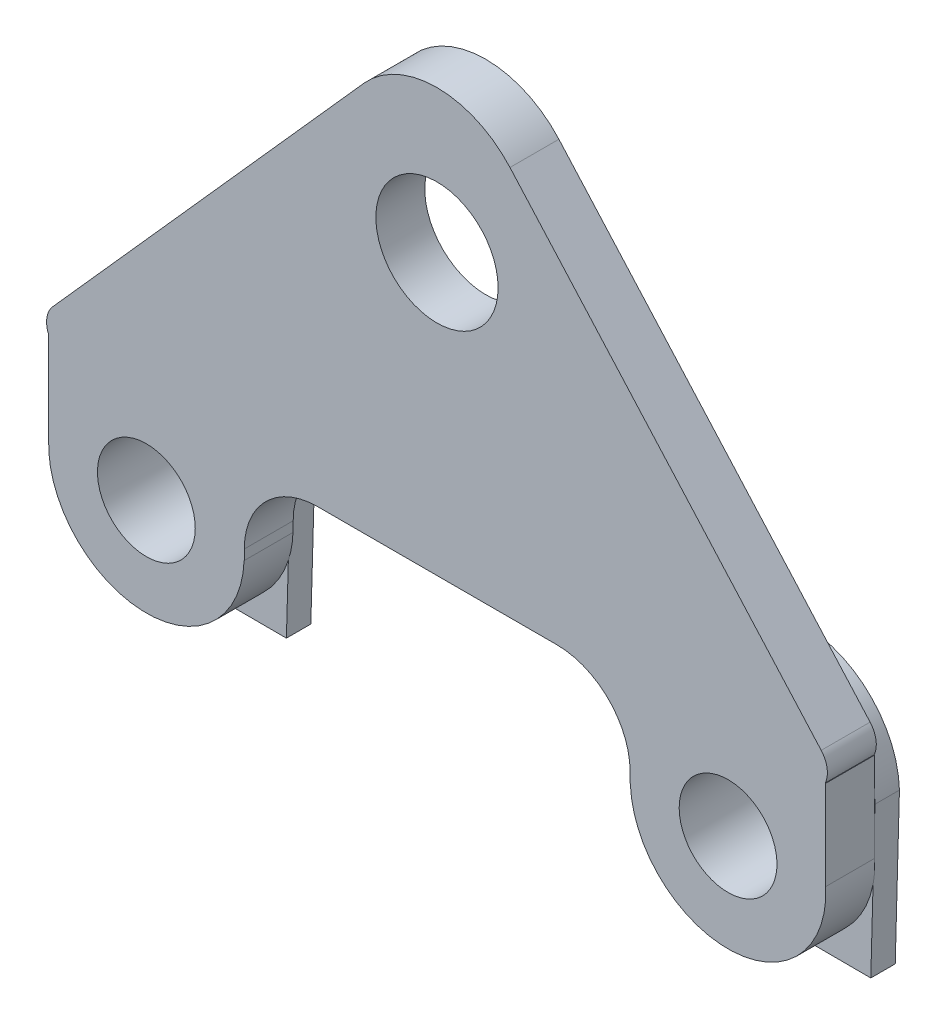
ISO-10303-21;
HEADER;
FILE_DESCRIPTION(('STEP AP214'),'2;1');
FILE_NAME('part.step','',(''),(''),'','','');
FILE_SCHEMA(('AUTOMOTIVE_DESIGN { 1 0 10303 214 1 1 1 1 }'));
ENDSEC;
DATA;
#1=APPLICATION_CONTEXT('core data for automotive mechanical design processes');
#2=APPLICATION_PROTOCOL_DEFINITION('international standard','automotive_design',2000,#1);
#3=PRODUCT_CONTEXT('',#1,'mechanical');
#4=PRODUCT('Part','Part','',(#3));
#5=PRODUCT_RELATED_PRODUCT_CATEGORY('part','',(#4));
#6=PRODUCT_DEFINITION_FORMATION('','',#4);
#7=PRODUCT_DEFINITION_CONTEXT('part definition',#1,'design');
#8=PRODUCT_DEFINITION('design','',#6,#7);
#9=PRODUCT_DEFINITION_SHAPE('','',#8);
#10=(LENGTH_UNIT() NAMED_UNIT(*) SI_UNIT(.MILLI.,.METRE.));
#11=(NAMED_UNIT(*) PLANE_ANGLE_UNIT() SI_UNIT($,.RADIAN.));
#12=(NAMED_UNIT(*) SI_UNIT($,.STERADIAN.) SOLID_ANGLE_UNIT());
#13=UNCERTAINTY_MEASURE_WITH_UNIT(LENGTH_MEASURE(1.E-05),#10,'distance_accuracy_value','');
#14=(GEOMETRIC_REPRESENTATION_CONTEXT(3) GLOBAL_UNCERTAINTY_ASSIGNED_CONTEXT((#13)) GLOBAL_UNIT_ASSIGNED_CONTEXT((#10,
#11,#12)) REPRESENTATION_CONTEXT('',''));
#15=CARTESIAN_POINT('',(0.,0.,0.));
#16=DIRECTION('',(0.,0.,1.));
#17=DIRECTION('',(1.,0.,0.));
#18=AXIS2_PLACEMENT_3D('',#15,#16,#17);
#19=CARTESIAN_POINT('',(0.,0.,0.));
#20=DIRECTION('',(0.,0.,-1.));
#21=DIRECTION('',(-1.,0.,0.));
#22=AXIS2_PLACEMENT_3D('',#19,#20,#21);
#23=PLANE('',#22);
#24=CARTESIAN_POINT('',(9.68072200830674,22.887439188464,0.));
#25=DIRECTION('',(0.,0.,1.));
#26=DIRECTION('',(1.,0.,0.));
#27=AXIS2_PLACEMENT_3D('',#24,#25,#26);
#28=CIRCLE('',#27,5.);
#29=CARTESIAN_POINT('',(14.6807220083067,22.887439188464,0.));
#30=VERTEX_POINT('',#29);
#31=EDGE_CURVE('E377',#30,#30,#28,.T.);
#32=ORIENTED_EDGE('',*,*,#31,.T.);
#33=EDGE_LOOP('',(#32));
#34=FACE_BOUND('',#33,.T.);
#35=CARTESIAN_POINT('',(-14.0923385126825,-6.5484072425761,0.));
#36=DIRECTION('',(0.,0.,1.));
#37=DIRECTION('',(1.,0.,0.));
#38=AXIS2_PLACEMENT_3D('',#35,#36,#37);
#39=CIRCLE('',#38,8.);
#40=CARTESIAN_POINT('',(-6.47842129879628,-9.00365970619087,0.));
#41=VERTEX_POINT('',#40);
#42=CARTESIAN_POINT('',(-6.09688509947379,-6.81808244946121,0.));
#43=VERTEX_POINT('',#42);
#44=EDGE_CURVE('E350',#41,#43,#39,.T.);
#45=ORIENTED_EDGE('',*,*,#44,.F.);
#46=DIRECTION('',(-0.0284940678115192,-0.999593961616192,0.));
#47=VECTOR('',#46,1.);
#48=CARTESIAN_POINT('',(-6.3007414125917,-2.77051172164984,0.));
#49=LINE('',#48,#47);
#50=CARTESIAN_POINT('',(-6.3007414125917,-2.77051172164984,0.));
#51=VERTEX_POINT('',#50);
#52=EDGE_CURVE('E54',#51,#41,#49,.T.);
#53=ORIENTED_EDGE('',*,*,#52,.F.);
#54=CARTESIAN_POINT('',(-14.0923385126825,-2.5484072425761,0.));
#55=DIRECTION('',(0.,0.,-1.));
#56=DIRECTION('',(-1.,0.,0.));
#57=AXIS2_PLACEMENT_3D('',#54,#55,#56);
#58=CIRCLE('',#57,7.79476207268501);
#59=CARTESIAN_POINT('',(-21.8839356127734,-2.32630276350236,0.));
#60=VERTEX_POINT('',#59);
#61=EDGE_CURVE('E258',#60,#51,#58,.T.);
#62=ORIENTED_EDGE('',*,*,#61,.F.);
#63=DIRECTION('',(0.0284940678115191,0.999593961616192,0.));
#64=VECTOR('',#63,1.);
#65=CARTESIAN_POINT('',(-21.8839356127734,-2.32630276350236,0.));
#66=LINE('',#65,#64);
#67=CARTESIAN_POINT('',(-22.0321989801702,-7.5274964912289,0.));
#68=VERTEX_POINT('',#67);
#69=EDGE_CURVE('E468',#68,#60,#66,.T.);
#70=ORIENTED_EDGE('',*,*,#69,.F.);
#71=CARTESIAN_POINT('',(-22.081618266519,-6.13439152434961,0.));
#72=VERTEX_POINT('',#71);
#73=EDGE_CURVE('E346',#72,#68,#39,.T.);
#74=ORIENTED_EDGE('',*,*,#73,.F.);
#75=DIRECTION('',(0.,-1.,0.));
#76=VECTOR('',#75,1.);
#77=CARTESIAN_POINT('',(-22.081618266519,-6.81808244946121,0.));
#78=LINE('',#77,#76);
#79=CARTESIAN_POINT('',(-22.081618266519,1.18191755053879,0.));
#80=VERTEX_POINT('',#79);
#81=EDGE_CURVE('E354',#80,#72,#78,.T.);
#82=ORIENTED_EDGE('',*,*,#81,.F.);
#83=CARTESIAN_POINT('',(-20.2565864569651,2.,0.));
#84=DIRECTION('',(0.,0.,-1.));
#85=DIRECTION('',(-1.,0.,0.));
#86=AXIS2_PLACEMENT_3D('',#83,#84,#85);
#87=CIRCLE('',#86,2.);
#88=CARTESIAN_POINT('',(-21.7496129500696,3.33074110588354,0.));
#89=VERTEX_POINT('',#88);
#90=EDGE_CURVE('E412',#80,#89,#87,.T.);
#91=ORIENTED_EDGE('',*,*,#90,.T.);
#92=DIRECTION('',(-0.665370552941771,-0.746513246552237,0.));
#93=VECTOR('',#92,1.);
#94=CARTESIAN_POINT('',(-24.718317204901,0.,0.));
#95=LINE('',#94,#93);
#96=CARTESIAN_POINT('',(3.70861603588884,31.8936299920127,0.));
#97=VERTEX_POINT('',#96);
#98=EDGE_CURVE('E380',#97,#89,#95,.T.);
#99=ORIENTED_EDGE('',*,*,#98,.F.);
#100=CARTESIAN_POINT('',(9.68072200830674,26.5706655684785,0.));
#101=DIRECTION('',(0.,0.,-1.));
#102=DIRECTION('',(-1.,0.,0.));
#103=AXIS2_PLACEMENT_3D('',#100,#101,#102);
#104=CIRCLE('',#103,8.);
#105=CARTESIAN_POINT('',(15.6528279807246,31.8936299920127,0.));
#106=VERTEX_POINT('',#105);
#107=EDGE_CURVE('E401',#97,#106,#104,.T.);
#108=ORIENTED_EDGE('',*,*,#107,.T.);
#109=DIRECTION('',(-0.665370552941771,0.746513246552237,0.));
#110=VECTOR('',#109,1.);
#111=CARTESIAN_POINT('',(9.68072200830674,38.5940410614726,0.));
#112=LINE('',#111,#110);
#113=CARTESIAN_POINT('',(41.1110569666831,3.33074110588354,0.));
#114=VERTEX_POINT('',#113);
#115=EDGE_CURVE('E387',#114,#106,#112,.T.);
#116=ORIENTED_EDGE('',*,*,#115,.F.);
#117=CARTESIAN_POINT('',(39.6180304735786,2.,0.));
#118=DIRECTION('',(0.,0.,-1.));
#119=DIRECTION('',(-1.,0.,0.));
#120=AXIS2_PLACEMENT_3D('',#117,#118,#119);
#121=CIRCLE('',#120,2.);
#122=CARTESIAN_POINT('',(41.4430622831325,1.18191755053879,0.));
#123=VERTEX_POINT('',#122);
#124=EDGE_CURVE('E409',#114,#123,#121,.T.);
#125=ORIENTED_EDGE('',*,*,#124,.T.);
#126=DIRECTION('',(1.,0.,0.));
#127=VECTOR('',#126,1.);
#128=CARTESIAN_POINT('',(41.481618266519,1.18191755053879,0.));
#129=LINE('',#128,#127);
#130=CARTESIAN_POINT('',(41.481618266519,1.18191755053879,0.));
#131=VERTEX_POINT('',#130);
#132=EDGE_CURVE('E330',#123,#131,#129,.T.);
#133=ORIENTED_EDGE('',*,*,#132,.T.);
#134=DIRECTION('',(0.,-1.,0.));
#135=VECTOR('',#134,1.);
#136=CARTESIAN_POINT('',(41.481618266519,-6.81808244946121,0.));
#137=LINE('',#136,#135);
#138=CARTESIAN_POINT('',(41.481618266519,-1.78936007365191,0.));
#139=VERTEX_POINT('',#138);
#140=EDGE_CURVE('E328',#131,#139,#137,.T.);
#141=ORIENTED_EDGE('',*,*,#140,.T.);
#142=CARTESIAN_POINT('',(33.4923385126826,-2.48234244489444,0.));
#143=DIRECTION('',(0.,0.,-1.));
#144=DIRECTION('',(-1.,0.,0.));
#145=AXIS2_PLACEMENT_3D('',#142,#143,#144);
#146=CIRCLE('',#145,8.01927774502876);
#147=CARTESIAN_POINT('',(25.4762813434412,-2.25509145728993,0.));
#148=VERTEX_POINT('',#147);
#149=EDGE_CURVE('E62',#148,#139,#146,.T.);
#150=ORIENTED_EDGE('',*,*,#149,.F.);
#151=DIRECTION('',(0.028338086649433,0.99959839577955,0.));
#152=VECTOR('',#151,1.);
#153=CARTESIAN_POINT('',(25.4762813434412,-2.25509145728993,0.));
#154=LINE('',#153,#152);
#155=CARTESIAN_POINT('',(25.3983543430884,-5.00389046775868,0.));
#156=VERTEX_POINT('',#155);
#157=EDGE_CURVE('E11',#156,#148,#154,.T.);
#158=ORIENTED_EDGE('',*,*,#157,.F.);
#159=CARTESIAN_POINT('',(19.481618266519,-6.,0.));
#160=DIRECTION('',(0.,0.,-1.));
#161=DIRECTION('',(-1.,0.,0.));
#162=AXIS2_PLACEMENT_3D('',#159,#160,#161);
#163=CIRCLE('',#162,6.);
#164=CARTESIAN_POINT('',(19.481618266519,0.,0.));
#165=VERTEX_POINT('',#164);
#166=EDGE_CURVE('E448',#156,#165,#163,.F.);
#167=ORIENTED_EDGE('',*,*,#166,.T.);
#168=DIRECTION('',(1.,0.,0.));
#169=VECTOR('',#168,1.);
#170=CARTESIAN_POINT('',(-24.718317204901,0.,0.));
#171=LINE('',#170,#169);
#172=CARTESIAN_POINT('',(-0.0816182665190172,0.,0.));
#173=VERTEX_POINT('',#172);
#174=EDGE_CURVE('E395',#173,#165,#171,.T.);
#175=ORIENTED_EDGE('',*,*,#174,.F.);
#176=CARTESIAN_POINT('',(-0.081618266519019,-6.,0.));
#177=DIRECTION('',(0.,0.,-1.));
#178=DIRECTION('',(-1.,0.,0.));
#179=AXIS2_PLACEMENT_3D('',#176,#177,#178);
#180=CIRCLE('',#179,6.);
#181=CARTESIAN_POINT('',(-6.08161826651902,-6.,0.));
#182=VERTEX_POINT('',#181);
#183=EDGE_CURVE('E434',#173,#182,#180,.F.);
#184=ORIENTED_EDGE('',*,*,#183,.T.);
#185=DIRECTION('',(0.,1.,0.));
#186=VECTOR('',#185,1.);
#187=CARTESIAN_POINT('',(-6.08161826651902,1.18191755053879,0.));
#188=LINE('',#187,#186);
#189=CARTESIAN_POINT('',(-6.08161826651902,-6.81808244946121,0.));
#190=VERTEX_POINT('',#189);
#191=EDGE_CURVE('E359',#190,#182,#188,.T.);
#192=ORIENTED_EDGE('',*,*,#191,.F.);
#193=DIRECTION('',(1.,0.,0.));
#194=VECTOR('',#193,1.);
#195=CARTESIAN_POINT('',(-6.08161826651902,-6.81808244946121,0.));
#196=LINE('',#195,#194);
#197=EDGE_CURVE('E367',#43,#190,#196,.T.);
#198=ORIENTED_EDGE('',*,*,#197,.F.);
#199=EDGE_LOOP('',(#45,#53,#62,#70,#74,#82,#91,#99,#108,#116,#125,#133,#141,#150,#158,#167,#175,
#184,#192,#198));
#200=FACE_BOUND('',#199,.T.);
#201=ADVANCED_FACE('F36',(#34,#200),#23,.T.);
#202=CARTESIAN_POINT('',(41.481618266519,-6.81808244946121,4.));
#203=DIRECTION('',(1.,0.,0.));
#204=DIRECTION('',(0.,0.,-1.));
#205=AXIS2_PLACEMENT_3D('',#202,#203,#204);
#206=PLANE('',#205);
#207=DIRECTION('',(0.,-1.,0.));
#208=VECTOR('',#207,1.);
#209=CARTESIAN_POINT('',(41.481618266519,-6.81808244946121,4.));
#210=LINE('',#209,#208);
#211=CARTESIAN_POINT('',(41.481618266519,1.18191755053879,4.));
#212=VERTEX_POINT('',#211);
#213=CARTESIAN_POINT('',(41.481618266519,-6.13439152434948,4.));
#214=VERTEX_POINT('',#213);
#215=EDGE_CURVE('E317',#212,#214,#210,.T.);
#216=ORIENTED_EDGE('',*,*,#215,.T.);
#217=DIRECTION('',(0.,0.,1.));
#218=VECTOR('',#217,1.);
#219=CARTESIAN_POINT('',(41.481618266519,-6.13439152434948,0.));
#220=LINE('',#219,#218);
#221=CARTESIAN_POINT('',(41.481618266519,-6.13439152434948,0.));
#222=VERTEX_POINT('',#221);
#223=EDGE_CURVE('E310',#214,#222,#220,.F.);
#224=ORIENTED_EDGE('',*,*,#223,.T.);
#225=CARTESIAN_POINT('',(41.481618266519,-3.28919382214651,0.));
#226=VERTEX_POINT('',#225);
#227=EDGE_CURVE('E316',#226,#222,#137,.T.);
#228=ORIENTED_EDGE('',*,*,#227,.F.);
#229=EDGE_CURVE('E331',#139,#226,#137,.T.);
#230=ORIENTED_EDGE('',*,*,#229,.F.);
#231=ORIENTED_EDGE('',*,*,#140,.F.);
#232=DIRECTION('',(0.,0.,-1.));
#233=VECTOR('',#232,1.);
#234=CARTESIAN_POINT('',(41.481618266519,1.18191755053879,4.));
#235=LINE('',#234,#233);
#236=EDGE_CURVE('E339',#212,#131,#235,.T.);
#237=ORIENTED_EDGE('',*,*,#236,.F.);
#238=EDGE_LOOP('',(#216,#224,#228,#230,#231,#237));
#239=FACE_BOUND('',#238,.T.);
#240=ADVANCED_FACE('F533',(#239),#206,.T.);
#241=CARTESIAN_POINT('',(25.481618266519,-6.81808244946121,4.));
#242=DIRECTION('',(0.,-1.,0.));
#243=DIRECTION('',(1.,0.,0.));
#244=AXIS2_PLACEMENT_3D('',#241,#242,#243);
#245=PLANE('',#244);
#246=DIRECTION('',(-1.,0.,0.));
#247=VECTOR('',#246,1.);
#248=CARTESIAN_POINT('',(25.481618266519,-6.81808244946121,0.));
#249=LINE('',#248,#247);
#250=CARTESIAN_POINT('',(25.4968850994738,-6.81808244946121,0.));
#251=VERTEX_POINT('',#250);
#252=CARTESIAN_POINT('',(25.481618266519,-6.81808244946121,0.));
#253=VERTEX_POINT('',#252);
#254=EDGE_CURVE('E320',#251,#253,#249,.T.);
#255=ORIENTED_EDGE('',*,*,#254,.F.);
#256=DIRECTION('',(0.,0.,1.));
#257=VECTOR('',#256,1.);
#258=CARTESIAN_POINT('',(25.4968850994738,-6.81808244946121,0.));
#259=LINE('',#258,#257);
#260=CARTESIAN_POINT('',(25.4968850994738,-6.81808244946121,4.));
#261=VERTEX_POINT('',#260);
#262=EDGE_CURVE('E438',#251,#261,#259,.T.);
#263=ORIENTED_EDGE('',*,*,#262,.T.);
#264=DIRECTION('',(-1.,0.,0.));
#265=VECTOR('',#264,1.);
#266=CARTESIAN_POINT('',(25.481618266519,-6.81808244946121,4.));
#267=LINE('',#266,#265);
#268=CARTESIAN_POINT('',(25.481618266519,-6.81808244946121,4.));
#269=VERTEX_POINT('',#268);
#270=EDGE_CURVE('E325',#261,#269,#267,.T.);
#271=ORIENTED_EDGE('',*,*,#270,.T.);
#272=DIRECTION('',(0.,0.,-1.));
#273=VECTOR('',#272,1.);
#274=CARTESIAN_POINT('',(25.481618266519,-6.81808244946121,4.));
#275=LINE('',#274,#273);
#276=EDGE_CURVE('E327',#269,#253,#275,.T.);
#277=ORIENTED_EDGE('',*,*,#276,.T.);
#278=EDGE_LOOP('',(#255,#263,#271,#277));
#279=FACE_BOUND('',#278,.T.);
#280=ADVANCED_FACE('F609',(#279),#245,.T.);
#281=CARTESIAN_POINT('',(-24.718317204901,0.,4.));
#282=DIRECTION('',(0.,1.,0.));
#283=DIRECTION('',(0.,0.,1.));
#284=AXIS2_PLACEMENT_3D('',#281,#282,#283);
#285=PLANE('',#284);
#286=ORIENTED_EDGE('',*,*,#174,.T.);
#287=DIRECTION('',(0.,0.,1.));
#288=VECTOR('',#287,1.);
#289=CARTESIAN_POINT('',(19.481618266519,0.,4.));
#290=LINE('',#289,#288);
#291=CARTESIAN_POINT('',(19.481618266519,0.,4.));
#292=VERTEX_POINT('',#291);
#293=EDGE_CURVE('E441',#165,#292,#290,.T.);
#294=ORIENTED_EDGE('',*,*,#293,.T.);
#295=DIRECTION('',(1.,0.,0.));
#296=VECTOR('',#295,1.);
#297=CARTESIAN_POINT('',(-24.718317204901,0.,4.));
#298=LINE('',#297,#296);
#299=CARTESIAN_POINT('',(-0.0816182665190172,0.,4.));
#300=VERTEX_POINT('',#299);
#301=EDGE_CURVE('E386',#300,#292,#298,.T.);
#302=ORIENTED_EDGE('',*,*,#301,.F.);
#303=DIRECTION('',(0.,0.,1.));
#304=VECTOR('',#303,1.);
#305=CARTESIAN_POINT('',(-0.081618266519019,0.,0.));
#306=LINE('',#305,#304);
#307=EDGE_CURVE('E430',#300,#173,#306,.F.);
#308=ORIENTED_EDGE('',*,*,#307,.T.);
#309=EDGE_LOOP('',(#286,#294,#302,#308));
#310=FACE_BOUND('',#309,.T.);
#311=ADVANCED_FACE('F579',(#310),#285,.F.);
#312=CARTESIAN_POINT('',(-20.2565864569651,2.,4.));
#313=DIRECTION('',(0.,0.,-1.));
#314=DIRECTION('',(-1.,0.,0.));
#315=AXIS2_PLACEMENT_3D('',#312,#313,#314);
#316=CYLINDRICAL_SURFACE('',#315,2.);
#317=ORIENTED_EDGE('',*,*,#90,.F.);
#318=DIRECTION('',(0.,0.,-1.));
#319=VECTOR('',#318,1.);
#320=CARTESIAN_POINT('',(-22.081618266519,1.18191755053879,4.));
#321=LINE('',#320,#319);
#322=CARTESIAN_POINT('',(-22.081618266519,1.18191755053879,4.));
#323=VERTEX_POINT('',#322);
#324=EDGE_CURVE('E364',#323,#80,#321,.T.);
#325=ORIENTED_EDGE('',*,*,#324,.F.);
#326=CARTESIAN_POINT('',(-20.2565864569651,2.,4.));
#327=DIRECTION('',(0.,0.,-1.));
#328=DIRECTION('',(-1.,0.,0.));
#329=AXIS2_PLACEMENT_3D('',#326,#327,#328);
#330=CIRCLE('',#329,2.);
#331=CARTESIAN_POINT('',(-21.7496129500696,3.33074110588354,4.));
#332=VERTEX_POINT('',#331);
#333=EDGE_CURVE('E418',#332,#323,#330,.F.);
#334=ORIENTED_EDGE('',*,*,#333,.F.);
#335=DIRECTION('',(0.,0.,-1.));
#336=VECTOR('',#335,1.);
#337=CARTESIAN_POINT('',(-21.7496129500696,3.33074110588354,4.));
#338=LINE('',#337,#336);
#339=EDGE_CURVE('E414',#89,#332,#338,.F.);
#340=ORIENTED_EDGE('',*,*,#339,.F.);
#341=EDGE_LOOP('',(#317,#325,#334,#340));
#342=FACE_BOUND('',#341,.T.);
#343=ADVANCED_FACE('F507',(#342),#316,.T.);
#344=CARTESIAN_POINT('',(-24.718317204901,0.,4.));
#345=DIRECTION('',(0.746513246552237,-0.665370552941771,0.));
#346=DIRECTION('',(0.665370552941771,0.746513246552237,0.));
#347=AXIS2_PLACEMENT_3D('',#344,#345,#346);
#348=PLANE('',#347);
#349=ORIENTED_EDGE('',*,*,#98,.T.);
#350=ORIENTED_EDGE('',*,*,#339,.T.);
#351=DIRECTION('',(-0.665370552941771,-0.746513246552237,0.));
#352=VECTOR('',#351,1.);
#353=CARTESIAN_POINT('',(-24.718317204901,0.,4.));
#354=LINE('',#353,#352);
#355=CARTESIAN_POINT('',(3.70861603588884,31.8936299920127,4.));
#356=VERTEX_POINT('',#355);
#357=EDGE_CURVE('E383',#356,#332,#354,.T.);
#358=ORIENTED_EDGE('',*,*,#357,.F.);
#359=DIRECTION('',(0.,0.,-1.));
#360=VECTOR('',#359,1.);
#361=CARTESIAN_POINT('',(3.70861603588885,31.8936299920127,4.));
#362=LINE('',#361,#360);
#363=EDGE_CURVE('E392',#356,#97,#362,.T.);
#364=ORIENTED_EDGE('',*,*,#363,.T.);
#365=EDGE_LOOP('',(#349,#350,#358,#364));
#366=FACE_BOUND('',#365,.T.);
#367=ADVANCED_FACE('F510',(#366),#348,.F.);
#368=CARTESIAN_POINT('',(9.68072200830674,38.5940410614726,4.));
#369=DIRECTION('',(-0.746513246552237,-0.665370552941771,0.));
#370=DIRECTION('',(0.665370552941771,-0.746513246552237,0.));
#371=AXIS2_PLACEMENT_3D('',#368,#369,#370);
#372=PLANE('',#371);
#373=DIRECTION('',(-0.665370552941771,0.746513246552237,0.));
#374=VECTOR('',#373,1.);
#375=CARTESIAN_POINT('',(9.68072200830674,38.5940410614726,4.));
#376=LINE('',#375,#374);
#377=CARTESIAN_POINT('',(41.1110569666831,3.33074110588354,4.));
#378=VERTEX_POINT('',#377);
#379=CARTESIAN_POINT('',(15.6528279807246,31.8936299920127,4.));
#380=VERTEX_POINT('',#379);
#381=EDGE_CURVE('E390',#378,#380,#376,.T.);
#382=ORIENTED_EDGE('',*,*,#381,.F.);
#383=DIRECTION('',(0.,0.,-1.));
#384=VECTOR('',#383,1.);
#385=CARTESIAN_POINT('',(41.1110569666831,3.33074110588356,4.));
#386=LINE('',#385,#384);
#387=EDGE_CURVE('E421',#378,#114,#386,.T.);
#388=ORIENTED_EDGE('',*,*,#387,.T.);
#389=ORIENTED_EDGE('',*,*,#115,.T.);
#390=DIRECTION('',(0.,0.,-1.));
#391=VECTOR('',#390,1.);
#392=CARTESIAN_POINT('',(15.6528279807246,31.8936299920127,4.));
#393=LINE('',#392,#391);
#394=EDGE_CURVE('E404',#106,#380,#393,.F.);
#395=ORIENTED_EDGE('',*,*,#394,.T.);
#396=EDGE_LOOP('',(#382,#388,#389,#395));
#397=FACE_BOUND('',#396,.T.);
#398=ADVANCED_FACE('F519',(#397),#372,.F.);
#399=CARTESIAN_POINT('',(0.,0.,4.));
#400=DIRECTION('',(0.,0.,-1.));
#401=DIRECTION('',(-1.,0.,0.));
#402=AXIS2_PLACEMENT_3D('',#399,#400,#401);
#403=PLANE('',#402);
#404=CARTESIAN_POINT('',(33.4923385126825,-6.5484072425761,4.));
#405=DIRECTION('',(0.,0.,-1.));
#406=DIRECTION('',(-1.,0.,0.));
#407=AXIS2_PLACEMENT_3D('',#404,#405,#406);
#408=CIRCLE('',#407,4.);
#409=CARTESIAN_POINT('',(29.4923385126825,-6.5484072425761,4.));
#410=VERTEX_POINT('',#409);
#411=EDGE_CURVE('E304',#410,#410,#408,.T.);
#412=ORIENTED_EDGE('',*,*,#411,.T.);
#413=EDGE_LOOP('',(#412));
#414=FACE_BOUND('',#413,.T.);
#415=ORIENTED_EDGE('',*,*,#270,.F.);
#416=CARTESIAN_POINT('',(33.4923385126825,-6.5484072425761,4.));
#417=DIRECTION('',(0.,0.,-1.));
#418=DIRECTION('',(-1.,0.,0.));
#419=AXIS2_PLACEMENT_3D('',#416,#417,#418);
#420=CIRCLE('',#419,8.);
#421=EDGE_CURVE('E307',#214,#261,#420,.T.);
#422=ORIENTED_EDGE('',*,*,#421,.F.);
#423=ORIENTED_EDGE('',*,*,#215,.F.);
#424=DIRECTION('',(1.,0.,0.));
#425=VECTOR('',#424,1.);
#426=CARTESIAN_POINT('',(41.481618266519,1.18191755053879,4.));
#427=LINE('',#426,#425);
#428=CARTESIAN_POINT('',(41.4430622831325,1.18191755053879,4.));
#429=VERTEX_POINT('',#428);
#430=EDGE_CURVE('E319',#429,#212,#427,.T.);
#431=ORIENTED_EDGE('',*,*,#430,.F.);
#432=CARTESIAN_POINT('',(39.6180304735786,2.,4.));
#433=DIRECTION('',(0.,0.,-1.));
#434=DIRECTION('',(-1.,0.,0.));
#435=AXIS2_PLACEMENT_3D('',#432,#433,#434);
#436=CIRCLE('',#435,2.);
#437=EDGE_CURVE('E416',#429,#378,#436,.F.);
#438=ORIENTED_EDGE('',*,*,#437,.T.);
#439=ORIENTED_EDGE('',*,*,#381,.T.);
#440=CARTESIAN_POINT('',(9.68072200830674,26.5706655684785,4.));
#441=DIRECTION('',(0.,0.,-1.));
#442=DIRECTION('',(-1.,0.,0.));
#443=AXIS2_PLACEMENT_3D('',#440,#441,#442);
#444=CIRCLE('',#443,8.);
#445=EDGE_CURVE('E407',#380,#356,#444,.F.);
#446=ORIENTED_EDGE('',*,*,#445,.T.);
#447=ORIENTED_EDGE('',*,*,#357,.T.);
#448=ORIENTED_EDGE('',*,*,#333,.T.);
#449=DIRECTION('',(0.,-1.,0.));
#450=VECTOR('',#449,1.);
#451=CARTESIAN_POINT('',(-22.081618266519,-6.81808244946121,4.));
#452=LINE('',#451,#450);
#453=CARTESIAN_POINT('',(-22.081618266519,-6.13439152434961,4.));
#454=VERTEX_POINT('',#453);
#455=EDGE_CURVE('E355',#323,#454,#452,.T.);
#456=ORIENTED_EDGE('',*,*,#455,.T.);
#457=CARTESIAN_POINT('',(-14.0923385126825,-6.5484072425761,4.));
#458=DIRECTION('',(0.,0.,1.));
#459=DIRECTION('',(1.,0.,0.));
#460=AXIS2_PLACEMENT_3D('',#457,#458,#459);
#461=CIRCLE('',#460,8.);
#462=CARTESIAN_POINT('',(-6.09688509947379,-6.81808244946121,4.));
#463=VERTEX_POINT('',#462);
#464=EDGE_CURVE('E345',#454,#463,#461,.T.);
#465=ORIENTED_EDGE('',*,*,#464,.T.);
#466=DIRECTION('',(1.,0.,0.));
#467=VECTOR('',#466,1.);
#468=CARTESIAN_POINT('',(-6.08161826651902,-6.81808244946121,4.));
#469=LINE('',#468,#467);
#470=CARTESIAN_POINT('',(-6.08161826651902,-6.81808244946121,4.));
#471=VERTEX_POINT('',#470);
#472=EDGE_CURVE('E358',#463,#471,#469,.T.);
#473=ORIENTED_EDGE('',*,*,#472,.T.);
#474=DIRECTION('',(0.,1.,0.));
#475=VECTOR('',#474,1.);
#476=CARTESIAN_POINT('',(-6.08161826651902,1.18191755053879,4.));
#477=LINE('',#476,#475);
#478=CARTESIAN_POINT('',(-6.08161826651902,-6.,4.));
#479=VERTEX_POINT('',#478);
#480=EDGE_CURVE('E361',#471,#479,#477,.T.);
#481=ORIENTED_EDGE('',*,*,#480,.T.);
#482=CARTESIAN_POINT('',(-0.081618266519019,-6.,4.));
#483=DIRECTION('',(0.,0.,-1.));
#484=DIRECTION('',(-1.,0.,0.));
#485=AXIS2_PLACEMENT_3D('',#482,#483,#484);
#486=CIRCLE('',#485,6.);
#487=EDGE_CURVE('E432',#479,#300,#486,.T.);
#488=ORIENTED_EDGE('',*,*,#487,.T.);
#489=ORIENTED_EDGE('',*,*,#301,.T.);
#490=CARTESIAN_POINT('',(19.481618266519,-6.,4.));
#491=DIRECTION('',(0.,0.,-1.));
#492=DIRECTION('',(-1.,0.,0.));
#493=AXIS2_PLACEMENT_3D('',#490,#491,#492);
#494=CIRCLE('',#493,6.);
#495=CARTESIAN_POINT('',(25.481618266519,-6.,4.));
#496=VERTEX_POINT('',#495);
#497=EDGE_CURVE('E446',#292,#496,#494,.T.);
#498=ORIENTED_EDGE('',*,*,#497,.T.);
#499=DIRECTION('',(0.,1.,0.));
#500=VECTOR('',#499,1.);
#501=CARTESIAN_POINT('',(25.481618266519,1.18191755053879,4.));
#502=LINE('',#501,#500);
#503=EDGE_CURVE('E322',#269,#496,#502,.T.);
#504=ORIENTED_EDGE('',*,*,#503,.F.);
#505=EDGE_LOOP('',(#415,#422,#423,#431,#438,#439,#446,#447,#448,#456,#465,#473,#481,#488,#489,
#498,#504));
#506=FACE_BOUND('',#505,.T.);
#507=CARTESIAN_POINT('',(-14.0923385126825,-6.5484072425761,4.));
#508=DIRECTION('',(0.,0.,1.));
#509=DIRECTION('',(1.,0.,0.));
#510=AXIS2_PLACEMENT_3D('',#507,#508,#509);
#511=CIRCLE('',#510,4.);
#512=CARTESIAN_POINT('',(-10.0923385126825,-6.5484072425761,4.));
#513=VERTEX_POINT('',#512);
#514=EDGE_CURVE('E342',#513,#513,#511,.T.);
#515=ORIENTED_EDGE('',*,*,#514,.F.);
#516=EDGE_LOOP('',(#515));
#517=FACE_BOUND('',#516,.T.);
#518=CARTESIAN_POINT('',(9.68072200830674,22.887439188464,4.));
#519=DIRECTION('',(0.,0.,1.));
#520=DIRECTION('',(1.,0.,0.));
#521=AXIS2_PLACEMENT_3D('',#518,#519,#520);
#522=CIRCLE('',#521,5.);
#523=CARTESIAN_POINT('',(14.6807220083067,22.887439188464,4.));
#524=VERTEX_POINT('',#523);
#525=EDGE_CURVE('E376',#524,#524,#522,.T.);
#526=ORIENTED_EDGE('',*,*,#525,.F.);
#527=EDGE_LOOP('',(#526));
#528=FACE_BOUND('',#527,.T.);
#529=ADVANCED_FACE('F500',(#414,#506,#517,#528),#403,.F.);
#530=DIRECTION('',(-0.0274378478863991,-0.999623511379841,0.));
#531=VECTOR('',#530,1.);
#532=CARTESIAN_POINT('',(41.509184817432,-2.28488136533878,0.));
#533=LINE('',#532,#531);
#534=CARTESIAN_POINT('',(41.3510758359377,-8.04515294044065,0.));
#535=VERTEX_POINT('',#534);
#536=EDGE_CURVE('E45',#226,#535,#533,.T.);
#537=ORIENTED_EDGE('',*,*,#536,.F.);
#538=ORIENTED_EDGE('',*,*,#227,.T.);
#539=CARTESIAN_POINT('',(33.4923385126825,-6.5484072425761,0.));
#540=DIRECTION('',(0.,0.,-1.));
#541=DIRECTION('',(-1.,0.,0.));
#542=AXIS2_PLACEMENT_3D('',#539,#540,#541);
#543=CIRCLE('',#542,8.);
#544=EDGE_CURVE('E308',#222,#535,#543,.T.);
#545=ORIENTED_EDGE('',*,*,#544,.T.);
#546=EDGE_LOOP('',(#537,#538,#545));
#547=FACE_BOUND('',#546,.T.);
#548=ADVANCED_FACE('F544',(#547),#23,.T.);
#549=CARTESIAN_POINT('',(9.68072200830674,26.5706655684785,4.));
#550=DIRECTION('',(0.,0.,-1.));
#551=DIRECTION('',(-1.,0.,0.));
#552=AXIS2_PLACEMENT_3D('',#549,#550,#551);
#553=CYLINDRICAL_SURFACE('',#552,8.);
#554=ORIENTED_EDGE('',*,*,#445,.F.);
#555=ORIENTED_EDGE('',*,*,#394,.F.);
#556=ORIENTED_EDGE('',*,*,#107,.F.);
#557=ORIENTED_EDGE('',*,*,#363,.F.);
#558=EDGE_LOOP('',(#554,#555,#556,#557));
#559=FACE_BOUND('',#558,.T.);
#560=ADVANCED_FACE('F514',(#559),#553,.T.);
#561=CARTESIAN_POINT('',(39.6180304735786,2.,4.));
#562=DIRECTION('',(0.,0.,-1.));
#563=DIRECTION('',(-1.,0.,0.));
#564=AXIS2_PLACEMENT_3D('',#561,#562,#563);
#565=CYLINDRICAL_SURFACE('',#564,2.);
#566=DIRECTION('',(0.,0.,-1.));
#567=VECTOR('',#566,1.);
#568=CARTESIAN_POINT('',(41.4430622831325,1.18191755053879,4.));
#569=LINE('',#568,#567);
#570=EDGE_CURVE('E436',#123,#429,#569,.F.);
#571=ORIENTED_EDGE('',*,*,#570,.F.);
#572=ORIENTED_EDGE('',*,*,#124,.F.);
#573=ORIENTED_EDGE('',*,*,#387,.F.);
#574=ORIENTED_EDGE('',*,*,#437,.F.);
#575=EDGE_LOOP('',(#571,#572,#573,#574));
#576=FACE_BOUND('',#575,.T.);
#577=ADVANCED_FACE('F524',(#576),#565,.T.);
#578=CARTESIAN_POINT('',(9.68072200830674,22.887439188464,0.));
#579=DIRECTION('',(0.,0.,1.));
#580=DIRECTION('',(1.,0.,0.));
#581=AXIS2_PLACEMENT_3D('',#578,#579,#580);
#582=CYLINDRICAL_SURFACE('',#581,5.);
#583=ORIENTED_EDGE('',*,*,#31,.F.);
#584=EDGE_LOOP('',(#583));
#585=FACE_BOUND('',#584,.T.);
#586=ORIENTED_EDGE('',*,*,#525,.T.);
#587=EDGE_LOOP('',(#586));
#588=FACE_BOUND('',#587,.T.);
#589=ADVANCED_FACE('F624',(#585,#588),#582,.F.);
#590=CARTESIAN_POINT('',(-6.08161826651902,1.18191755053879,4.));
#591=DIRECTION('',(-1.,0.,0.));
#592=DIRECTION('',(0.,0.,1.));
#593=AXIS2_PLACEMENT_3D('',#590,#591,#592);
#594=PLANE('',#593);
#595=ORIENTED_EDGE('',*,*,#191,.T.);
#596=DIRECTION('',(0.,0.,1.));
#597=VECTOR('',#596,1.);
#598=CARTESIAN_POINT('',(-6.08161826651902,-6.,4.));
#599=LINE('',#598,#597);
#600=EDGE_CURVE('E427',#182,#479,#599,.T.);
#601=ORIENTED_EDGE('',*,*,#600,.T.);
#602=ORIENTED_EDGE('',*,*,#480,.F.);
#603=DIRECTION('',(0.,0.,-1.));
#604=VECTOR('',#603,1.);
#605=CARTESIAN_POINT('',(-6.08161826651902,-6.81808244946121,4.));
#606=LINE('',#605,#604);
#607=EDGE_CURVE('E373',#471,#190,#606,.T.);
#608=ORIENTED_EDGE('',*,*,#607,.T.);
#609=EDGE_LOOP('',(#595,#601,#602,#608));
#610=FACE_BOUND('',#609,.T.);
#611=ADVANCED_FACE('F587',(#610),#594,.F.);
#612=CARTESIAN_POINT('',(-22.081618266519,-6.81808244946121,4.));
#613=DIRECTION('',(1.,0.,0.));
#614=DIRECTION('',(0.,0.,-1.));
#615=AXIS2_PLACEMENT_3D('',#612,#613,#614);
#616=PLANE('',#615);
#617=ORIENTED_EDGE('',*,*,#81,.T.);
#618=DIRECTION('',(0.,0.,1.));
#619=VECTOR('',#618,1.);
#620=CARTESIAN_POINT('',(-22.081618266519,-6.13439152434961,0.));
#621=LINE('',#620,#619);
#622=EDGE_CURVE('E349',#72,#454,#621,.T.);
#623=ORIENTED_EDGE('',*,*,#622,.T.);
#624=ORIENTED_EDGE('',*,*,#455,.F.);
#625=ORIENTED_EDGE('',*,*,#324,.T.);
#626=EDGE_LOOP('',(#617,#623,#624,#625));
#627=FACE_BOUND('',#626,.T.);
#628=ADVANCED_FACE('F497',(#627),#616,.F.);
#629=CARTESIAN_POINT('',(-6.08161826651902,-6.81808244946121,4.));
#630=DIRECTION('',(0.,1.,0.));
#631=DIRECTION('',(-1.,0.,0.));
#632=AXIS2_PLACEMENT_3D('',#629,#630,#631);
#633=PLANE('',#632);
#634=ORIENTED_EDGE('',*,*,#472,.F.);
#635=DIRECTION('',(0.,0.,1.));
#636=VECTOR('',#635,1.);
#637=CARTESIAN_POINT('',(-6.09688509947379,-6.81808244946121,0.));
#638=LINE('',#637,#636);
#639=EDGE_CURVE('E424',#463,#43,#638,.F.);
#640=ORIENTED_EDGE('',*,*,#639,.T.);
#641=ORIENTED_EDGE('',*,*,#197,.T.);
#642=ORIENTED_EDGE('',*,*,#607,.F.);
#643=EDGE_LOOP('',(#634,#640,#641,#642));
#644=FACE_BOUND('',#643,.T.);
#645=ADVANCED_FACE('F593',(#644),#633,.F.);
#646=CARTESIAN_POINT('',(-14.0923385126825,-6.5484072425761,0.));
#647=DIRECTION('',(0.,0.,1.));
#648=DIRECTION('',(1.,0.,0.));
#649=AXIS2_PLACEMENT_3D('',#646,#647,#648);
#650=CYLINDRICAL_SURFACE('',#649,8.);
#651=ORIENTED_EDGE('',*,*,#622,.F.);
#652=ORIENTED_EDGE('',*,*,#73,.T.);
#653=CARTESIAN_POINT('',(-14.0923385126825,-6.5484072425761,0.));
#654=DIRECTION('',(0.,0.,-1.));
#655=DIRECTION('',(-1.,0.,0.));
#656=AXIS2_PLACEMENT_3D('',#653,#654,#655);
#657=CIRCLE('',#656,8.);
#658=EDGE_CURVE('E259',#68,#41,#657,.F.);
#659=ORIENTED_EDGE('',*,*,#658,.T.);
#660=ORIENTED_EDGE('',*,*,#44,.T.);
#661=ORIENTED_EDGE('',*,*,#639,.F.);
#662=ORIENTED_EDGE('',*,*,#464,.F.);
#663=EDGE_LOOP('',(#651,#652,#659,#660,#661,#662));
#664=FACE_BOUND('',#663,.T.);
#665=ADVANCED_FACE('F494',(#664),#650,.T.);
#666=CARTESIAN_POINT('',(-0.081618266519019,-6.,4.));
#667=DIRECTION('',(0.,0.,-1.));
#668=DIRECTION('',(-1.,0.,0.));
#669=AXIS2_PLACEMENT_3D('',#666,#667,#668);
#670=CYLINDRICAL_SURFACE('',#669,6.);
#671=ORIENTED_EDGE('',*,*,#183,.F.);
#672=ORIENTED_EDGE('',*,*,#307,.F.);
#673=ORIENTED_EDGE('',*,*,#487,.F.);
#674=ORIENTED_EDGE('',*,*,#600,.F.);
#675=EDGE_LOOP('',(#671,#672,#673,#674));
#676=FACE_BOUND('',#675,.T.);
#677=ADVANCED_FACE('F585',(#676),#670,.F.);
#678=CARTESIAN_POINT('',(-14.0923385126825,-6.5484072425761,0.));
#679=DIRECTION('',(0.,0.,1.));
#680=DIRECTION('',(1.,0.,0.));
#681=AXIS2_PLACEMENT_3D('',#678,#679,#680);
#682=CYLINDRICAL_SURFACE('',#681,4.);
#683=ORIENTED_EDGE('',*,*,#514,.T.);
#684=EDGE_LOOP('',(#683));
#685=FACE_BOUND('',#684,.T.);
#686=CARTESIAN_POINT('',(-14.0923385126826,-6.54840724257619,-2.));
#687=DIRECTION('',(0.,0.,-1.));
#688=DIRECTION('',(-1.,0.,0.));
#689=AXIS2_PLACEMENT_3D('',#686,#687,#688);
#690=CIRCLE('',#689,4.);
#691=CARTESIAN_POINT('',(-18.0923385126826,-6.54840724257619,-2.));
#692=VERTEX_POINT('',#691);
#693=EDGE_CURVE('E451',#692,#692,#690,.F.);
#694=ORIENTED_EDGE('',*,*,#693,.F.);
#695=EDGE_LOOP('',(#694));
#696=FACE_BOUND('',#695,.T.);
#697=ADVANCED_FACE('F640',(#685,#696),#682,.F.);
#698=CARTESIAN_POINT('',(25.481618266519,1.18191755053879,4.));
#699=DIRECTION('',(-1.,0.,0.));
#700=DIRECTION('',(0.,0.,1.));
#701=AXIS2_PLACEMENT_3D('',#698,#699,#700);
#702=PLANE('',#701);
#703=ORIENTED_EDGE('',*,*,#503,.T.);
#704=DIRECTION('',(0.,0.,1.));
#705=VECTOR('',#704,1.);
#706=CARTESIAN_POINT('',(25.481618266519,-6.,4.));
#707=LINE('',#706,#705);
#708=CARTESIAN_POINT('',(25.481618266519,-6.,0.));
#709=VERTEX_POINT('',#708);
#710=EDGE_CURVE('E444',#496,#709,#707,.F.);
#711=ORIENTED_EDGE('',*,*,#710,.T.);
#712=DIRECTION('',(0.,1.,0.));
#713=VECTOR('',#712,1.);
#714=CARTESIAN_POINT('',(25.481618266519,1.18191755053879,0.));
#715=LINE('',#714,#713);
#716=EDGE_CURVE('E333',#253,#709,#715,.T.);
#717=ORIENTED_EDGE('',*,*,#716,.F.);
#718=ORIENTED_EDGE('',*,*,#276,.F.);
#719=EDGE_LOOP('',(#703,#711,#717,#718));
#720=FACE_BOUND('',#719,.T.);
#721=ADVANCED_FACE('F575',(#720),#702,.T.);
#722=CARTESIAN_POINT('',(41.481618266519,1.18191755053879,4.));
#723=DIRECTION('',(0.,1.,0.));
#724=DIRECTION('',(0.,0.,1.));
#725=AXIS2_PLACEMENT_3D('',#722,#723,#724);
#726=PLANE('',#725);
#727=ORIENTED_EDGE('',*,*,#132,.F.);
#728=ORIENTED_EDGE('',*,*,#570,.T.);
#729=ORIENTED_EDGE('',*,*,#430,.T.);
#730=ORIENTED_EDGE('',*,*,#236,.T.);
#731=EDGE_LOOP('',(#727,#728,#729,#730));
#732=FACE_BOUND('',#731,.T.);
#733=ADVANCED_FACE('F527',(#732),#726,.T.);
#734=CARTESIAN_POINT('',(33.4923385126825,-6.5484072425761,0.));
#735=DIRECTION('',(0.,0.,1.));
#736=DIRECTION('',(1.,0.,0.));
#737=AXIS2_PLACEMENT_3D('',#734,#735,#736);
#738=CYLINDRICAL_SURFACE('',#737,8.);
#739=ORIENTED_EDGE('',*,*,#223,.F.);
#740=ORIENTED_EDGE('',*,*,#421,.T.);
#741=ORIENTED_EDGE('',*,*,#262,.F.);
#742=EDGE_CURVE('E311',#535,#251,#543,.T.);
#743=ORIENTED_EDGE('',*,*,#742,.F.);
#744=ORIENTED_EDGE('',*,*,#544,.F.);
#745=EDGE_LOOP('',(#739,#740,#741,#743,#744));
#746=FACE_BOUND('',#745,.T.);
#747=ADVANCED_FACE('F538',(#746),#738,.T.);
#748=CARTESIAN_POINT('',(19.481618266519,-6.,4.));
#749=DIRECTION('',(0.,0.,1.));
#750=DIRECTION('',(1.,0.,0.));
#751=AXIS2_PLACEMENT_3D('',#748,#749,#750);
#752=CYLINDRICAL_SURFACE('',#751,6.);
#753=EDGE_CURVE('E449',#709,#156,#163,.F.);
#754=ORIENTED_EDGE('',*,*,#753,.F.);
#755=ORIENTED_EDGE('',*,*,#710,.F.);
#756=ORIENTED_EDGE('',*,*,#497,.F.);
#757=ORIENTED_EDGE('',*,*,#293,.F.);
#758=ORIENTED_EDGE('',*,*,#166,.F.);
#759=EDGE_LOOP('',(#754,#755,#756,#757,#758));
#760=FACE_BOUND('',#759,.T.);
#761=ADVANCED_FACE('F38',(#760),#752,.F.);
#762=CARTESIAN_POINT('',(33.4923385126825,-6.5484072425761,0.));
#763=DIRECTION('',(0.,0.,1.));
#764=DIRECTION('',(1.,0.,0.));
#765=AXIS2_PLACEMENT_3D('',#762,#763,#764);
#766=CYLINDRICAL_SURFACE('',#765,4.);
#767=ORIENTED_EDGE('',*,*,#411,.F.);
#768=EDGE_LOOP('',(#767));
#769=FACE_BOUND('',#768,.T.);
#770=CARTESIAN_POINT('',(33.4923385126827,-6.54840724257611,-2.));
#771=DIRECTION('',(0.,0.,-1.));
#772=DIRECTION('',(-1.,0.,0.));
#773=AXIS2_PLACEMENT_3D('',#770,#771,#772);
#774=CIRCLE('',#773,4.);
#775=CARTESIAN_POINT('',(29.4923385126827,-6.54840724257611,-2.));
#776=VERTEX_POINT('',#775);
#777=EDGE_CURVE('E40',#776,#776,#774,.F.);
#778=ORIENTED_EDGE('',*,*,#777,.F.);
#779=EDGE_LOOP('',(#778));
#780=FACE_BOUND('',#779,.T.);
#781=ADVANCED_FACE('F659',(#769,#780),#766,.F.);
#782=CARTESIAN_POINT('',(33.4923385126826,-2.48234244489444,-2.));
#783=DIRECTION('',(0.,0.,-1.));
#784=DIRECTION('',(-1.,0.,0.));
#785=AXIS2_PLACEMENT_3D('',#782,#783,#784);
#786=PLANE('',#785);
#787=ORIENTED_EDGE('',*,*,#777,.T.);
#788=EDGE_LOOP('',(#787));
#789=FACE_BOUND('',#788,.T.);
#790=CARTESIAN_POINT('',(33.4923385126826,-2.48234244489444,-2.));
#791=DIRECTION('',(0.,0.,-1.));
#792=DIRECTION('',(-1.,0.,0.));
#793=AXIS2_PLACEMENT_3D('',#790,#791,#792);
#794=CIRCLE('',#793,8.01927774502876);
#795=CARTESIAN_POINT('',(25.4762813434412,-2.25509145728993,-2.));
#796=VERTEX_POINT('',#795);
#797=CARTESIAN_POINT('',(41.509184817432,-2.28488136533878,-2.));
#798=VERTEX_POINT('',#797);
#799=EDGE_CURVE('E268',#796,#798,#794,.T.);
#800=ORIENTED_EDGE('',*,*,#799,.T.);
#801=DIRECTION('',(-0.0274378478863991,-0.999623511379841,0.));
#802=VECTOR('',#801,1.);
#803=CARTESIAN_POINT('',(41.509184817432,-2.28488136533878,-2.));
#804=LINE('',#803,#802);
#805=CARTESIAN_POINT('',(41.1665362827736,-14.7683506520878,-2.));
#806=VERTEX_POINT('',#805);
#807=EDGE_CURVE('E271',#798,#806,#804,.T.);
#808=ORIENTED_EDGE('',*,*,#807,.T.);
#809=DIRECTION('',(-0.999993575185904,0.00358463204706208,0.));
#810=VECTOR('',#809,1.);
#811=CARTESIAN_POINT('',(41.1665362827736,-14.7683506520878,-2.));
#812=LINE('',#811,#810);
#813=CARTESIAN_POINT('',(25.1329987384588,-14.7108759503144,-2.));
#814=VERTEX_POINT('',#813);
#815=EDGE_CURVE('E273',#806,#814,#812,.T.);
#816=ORIENTED_EDGE('',*,*,#815,.T.);
#817=DIRECTION('',(0.00358463204704473,0.999993575185904,0.));
#818=VECTOR('',#817,1.);
#819=CARTESIAN_POINT('',(25.1344219442905,-14.3138486768788,-2.));
#820=LINE('',#819,#818);
#821=CARTESIAN_POINT('',(25.1344219442905,-14.3138486768788,-2.));
#822=VERTEX_POINT('',#821);
#823=EDGE_CURVE('E275',#814,#822,#820,.T.);
#824=ORIENTED_EDGE('',*,*,#823,.T.);
#825=DIRECTION('',(0.028338086649433,0.99959839577955,0.));
#826=VECTOR('',#825,1.);
#827=CARTESIAN_POINT('',(25.4762813434412,-2.25509145728993,-2.));
#828=LINE('',#827,#826);
#829=EDGE_CURVE('E277',#822,#796,#828,.T.);
#830=ORIENTED_EDGE('',*,*,#829,.T.);
#831=EDGE_LOOP('',(#800,#808,#816,#824,#830));
#832=FACE_BOUND('',#831,.T.);
#833=ADVANCED_FACE('F662',(#789,#832),#786,.T.);
#834=CARTESIAN_POINT('',(25.4762813434412,-2.25509145728993,-2.));
#835=DIRECTION('',(0.99959839577955,-0.028338086649433,0.));
#836=DIRECTION('',(0.028338086649433,0.99959839577955,0.));
#837=AXIS2_PLACEMENT_3D('',#834,#835,#836);
#838=PLANE('',#837);
#839=CARTESIAN_POINT('',(25.1344219442905,-14.3138486768788,0.));
#840=VERTEX_POINT('',#839);
#841=EDGE_CURVE('E47',#840,#156,#154,.T.);
#842=ORIENTED_EDGE('',*,*,#841,.T.);
#843=ORIENTED_EDGE('',*,*,#157,.T.);
#844=DIRECTION('',(0.,0.,1.));
#845=VECTOR('',#844,1.);
#846=CARTESIAN_POINT('',(25.4762813434412,-2.25509145728993,-2.));
#847=LINE('',#846,#845);
#848=EDGE_CURVE('E279',#796,#148,#847,.T.);
#849=ORIENTED_EDGE('',*,*,#848,.F.);
#850=ORIENTED_EDGE('',*,*,#829,.F.);
#851=DIRECTION('',(0.,0.,1.));
#852=VECTOR('',#851,1.);
#853=CARTESIAN_POINT('',(25.1344219442905,-14.3138486768788,-2.));
#854=LINE('',#853,#852);
#855=EDGE_CURVE('E292',#822,#840,#854,.T.);
#856=ORIENTED_EDGE('',*,*,#855,.T.);
#857=EDGE_LOOP('',(#842,#843,#849,#850,#856));
#858=FACE_BOUND('',#857,.T.);
#859=ADVANCED_FACE('F561',(#858),#838,.F.);
#860=CARTESIAN_POINT('',(25.1344219442905,-14.3138486768788,-2.));
#861=DIRECTION('',(0.999993575185905,-0.00358463204704473,0.));
#862=DIRECTION('',(0.00358463204704473,0.999993575185905,0.));
#863=AXIS2_PLACEMENT_3D('',#860,#861,#862);
#864=PLANE('',#863);
#865=DIRECTION('',(0.00358463204704473,0.999993575185904,0.));
#866=VECTOR('',#865,1.);
#867=CARTESIAN_POINT('',(25.1344219442905,-14.3138486768788,0.));
#868=LINE('',#867,#866);
#869=CARTESIAN_POINT('',(25.1329987384588,-14.7108759503144,0.));
#870=VERTEX_POINT('',#869);
#871=EDGE_CURVE('E287',#870,#840,#868,.T.);
#872=ORIENTED_EDGE('',*,*,#871,.T.);
#873=ORIENTED_EDGE('',*,*,#855,.F.);
#874=ORIENTED_EDGE('',*,*,#823,.F.);
#875=DIRECTION('',(0.,0.,1.));
#876=VECTOR('',#875,1.);
#877=CARTESIAN_POINT('',(25.1329987384588,-14.7108759503144,-2.));
#878=LINE('',#877,#876);
#879=EDGE_CURVE('E295',#814,#870,#878,.T.);
#880=ORIENTED_EDGE('',*,*,#879,.T.);
#881=EDGE_LOOP('',(#872,#873,#874,#880));
#882=FACE_BOUND('',#881,.T.);
#883=ADVANCED_FACE('F671',(#882),#864,.F.);
#884=CARTESIAN_POINT('',(41.1665362827736,-14.7683506520878,-2.));
#885=DIRECTION('',(0.00358463204706208,0.999993575185905,0.));
#886=DIRECTION('',(-0.999993575185905,0.00358463204706208,0.));
#887=AXIS2_PLACEMENT_3D('',#884,#885,#886);
#888=PLANE('',#887);
#889=DIRECTION('',(-0.999993575185904,0.00358463204706208,0.));
#890=VECTOR('',#889,1.);
#891=CARTESIAN_POINT('',(41.1665362827736,-14.7683506520878,0.));
#892=LINE('',#891,#890);
#893=CARTESIAN_POINT('',(41.1665362827736,-14.7683506520878,0.));
#894=VERTEX_POINT('',#893);
#895=EDGE_CURVE('E285',#894,#870,#892,.T.);
#896=ORIENTED_EDGE('',*,*,#895,.T.);
#897=ORIENTED_EDGE('',*,*,#879,.F.);
#898=ORIENTED_EDGE('',*,*,#815,.F.);
#899=DIRECTION('',(0.,0.,1.));
#900=VECTOR('',#899,1.);
#901=CARTESIAN_POINT('',(41.1665362827736,-14.7683506520878,-2.));
#902=LINE('',#901,#900);
#903=EDGE_CURVE('E298',#806,#894,#902,.T.);
#904=ORIENTED_EDGE('',*,*,#903,.T.);
#905=EDGE_LOOP('',(#896,#897,#898,#904));
#906=FACE_BOUND('',#905,.T.);
#907=ADVANCED_FACE('F668',(#906),#888,.F.);
#908=CARTESIAN_POINT('',(41.509184817432,-2.28488136533878,-2.));
#909=DIRECTION('',(-0.999623511379841,0.0274378478863991,0.));
#910=DIRECTION('',(-0.0274378478863991,-0.999623511379841,0.));
#911=AXIS2_PLACEMENT_3D('',#908,#909,#910);
#912=PLANE('',#911);
#913=CARTESIAN_POINT('',(41.509184817432,-2.28488136533878,0.));
#914=VERTEX_POINT('',#913);
#915=EDGE_CURVE('E282',#914,#226,#533,.T.);
#916=ORIENTED_EDGE('',*,*,#915,.T.);
#917=ORIENTED_EDGE('',*,*,#536,.T.);
#918=EDGE_CURVE('E281',#535,#894,#533,.T.);
#919=ORIENTED_EDGE('',*,*,#918,.T.);
#920=ORIENTED_EDGE('',*,*,#903,.F.);
#921=ORIENTED_EDGE('',*,*,#807,.F.);
#922=DIRECTION('',(0.,0.,1.));
#923=VECTOR('',#922,1.);
#924=CARTESIAN_POINT('',(41.509184817432,-2.28488136533878,-2.));
#925=LINE('',#924,#923);
#926=EDGE_CURVE('E301',#798,#914,#925,.T.);
#927=ORIENTED_EDGE('',*,*,#926,.T.);
#928=EDGE_LOOP('',(#916,#917,#919,#920,#921,#927));
#929=FACE_BOUND('',#928,.T.);
#930=ADVANCED_FACE('F552',(#929),#912,.F.);
#931=CARTESIAN_POINT('',(33.4923385126826,-2.48234244489444,-2.));
#932=DIRECTION('',(0.,0.,1.));
#933=DIRECTION('',(1.,0.,0.));
#934=AXIS2_PLACEMENT_3D('',#931,#932,#933);
#935=CYLINDRICAL_SURFACE('',#934,8.01927774502876);
#936=ORIENTED_EDGE('',*,*,#149,.T.);
#937=EDGE_CURVE('E262',#139,#914,#146,.T.);
#938=ORIENTED_EDGE('',*,*,#937,.T.);
#939=ORIENTED_EDGE('',*,*,#926,.F.);
#940=ORIENTED_EDGE('',*,*,#799,.F.);
#941=ORIENTED_EDGE('',*,*,#848,.T.);
#942=EDGE_LOOP('',(#936,#938,#939,#940,#941));
#943=FACE_BOUND('',#942,.T.);
#944=ADVANCED_FACE('F557',(#943),#935,.T.);
#945=CARTESIAN_POINT('',(33.4923385126826,-2.48234244489444,0.));
#946=DIRECTION('',(0.,0.,-1.));
#947=DIRECTION('',(-1.,0.,0.));
#948=AXIS2_PLACEMENT_3D('',#945,#946,#947);
#949=PLANE('',#948);
#950=ORIENTED_EDGE('',*,*,#918,.F.);
#951=ORIENTED_EDGE('',*,*,#742,.T.);
#952=ORIENTED_EDGE('',*,*,#254,.T.);
#953=ORIENTED_EDGE('',*,*,#716,.T.);
#954=ORIENTED_EDGE('',*,*,#753,.T.);
#955=ORIENTED_EDGE('',*,*,#841,.F.);
#956=ORIENTED_EDGE('',*,*,#871,.F.);
#957=ORIENTED_EDGE('',*,*,#895,.F.);
#958=EDGE_LOOP('',(#950,#951,#952,#953,#954,#955,#956,#957));
#959=FACE_BOUND('',#958,.T.);
#960=ADVANCED_FACE('F570',(#959),#949,.F.);
#961=ORIENTED_EDGE('',*,*,#937,.F.);
#962=ORIENTED_EDGE('',*,*,#229,.T.);
#963=ORIENTED_EDGE('',*,*,#915,.F.);
#964=EDGE_LOOP('',(#961,#962,#963));
#965=FACE_BOUND('',#964,.T.);
#966=ADVANCED_FACE('F550',(#965),#949,.F.);
#967=CARTESIAN_POINT('',(-14.0923385126825,-2.5484072425761,-2.));
#968=DIRECTION('',(0.,0.,1.));
#969=DIRECTION('',(1.,0.,0.));
#970=AXIS2_PLACEMENT_3D('',#967,#968,#969);
#971=CYLINDRICAL_SURFACE('',#970,7.79476207268501);
#972=ORIENTED_EDGE('',*,*,#61,.T.);
#973=DIRECTION('',(0.,0.,1.));
#974=VECTOR('',#973,1.);
#975=CARTESIAN_POINT('',(-6.3007414125917,-2.77051172164984,-2.));
#976=LINE('',#975,#974);
#977=CARTESIAN_POINT('',(-6.3007414125917,-2.77051172164984,-2.));
#978=VERTEX_POINT('',#977);
#979=EDGE_CURVE('E238',#978,#51,#976,.T.);
#980=ORIENTED_EDGE('',*,*,#979,.F.);
#981=CARTESIAN_POINT('',(-14.0923385126825,-2.5484072425761,-2.));
#982=DIRECTION('',(0.,0.,-1.));
#983=DIRECTION('',(-1.,0.,0.));
#984=AXIS2_PLACEMENT_3D('',#981,#982,#983);
#985=CIRCLE('',#984,7.79476207268501);
#986=CARTESIAN_POINT('',(-21.8839356127734,-2.32630276350236,-2.));
#987=VERTEX_POINT('',#986);
#988=EDGE_CURVE('E245',#987,#978,#985,.T.);
#989=ORIENTED_EDGE('',*,*,#988,.F.);
#990=DIRECTION('',(0.,0.,1.));
#991=VECTOR('',#990,1.);
#992=CARTESIAN_POINT('',(-21.8839356127734,-2.32630276350236,-2.));
#993=LINE('',#992,#991);
#994=EDGE_CURVE('E471',#987,#60,#993,.T.);
#995=ORIENTED_EDGE('',*,*,#994,.T.);
#996=EDGE_LOOP('',(#972,#980,#989,#995));
#997=FACE_BOUND('',#996,.T.);
#998=ADVANCED_FACE('F256',(#997),#971,.T.);
#999=CARTESIAN_POINT('',(-6.3007414125917,-2.77051172164984,-2.));
#1000=DIRECTION('',(-0.999593961616192,0.0284940678115192,0.));
#1001=DIRECTION('',(-0.0284940678115192,-0.999593961616192,0.));
#1002=AXIS2_PLACEMENT_3D('',#999,#1000,#1001);
#1003=PLANE('',#1002);
#1004=ORIENTED_EDGE('',*,*,#52,.T.);
#1005=CARTESIAN_POINT('',(-6.63786272438642,-14.5969883704454,0.));
#1006=VERTEX_POINT('',#1005);
#1007=EDGE_CURVE('E458',#41,#1006,#49,.T.);
#1008=ORIENTED_EDGE('',*,*,#1007,.T.);
#1009=DIRECTION('',(0.,0.,1.));
#1010=VECTOR('',#1009,1.);
#1011=CARTESIAN_POINT('',(-6.63786272438642,-14.5969883704454,-2.));
#1012=LINE('',#1011,#1010);
#1013=CARTESIAN_POINT('',(-6.63786272438642,-14.5969883704454,-2.));
#1014=VERTEX_POINT('',#1013);
#1015=EDGE_CURVE('E241',#1014,#1006,#1012,.T.);
#1016=ORIENTED_EDGE('',*,*,#1015,.F.);
#1017=DIRECTION('',(-0.0284940678115192,-0.999593961616192,0.));
#1018=VECTOR('',#1017,1.);
#1019=CARTESIAN_POINT('',(-6.3007414125917,-2.77051172164984,-2.));
#1020=LINE('',#1019,#1018);
#1021=EDGE_CURVE('E234',#978,#1014,#1020,.T.);
#1022=ORIENTED_EDGE('',*,*,#1021,.F.);
#1023=ORIENTED_EDGE('',*,*,#979,.T.);
#1024=EDGE_LOOP('',(#1004,#1008,#1016,#1022,#1023));
#1025=FACE_BOUND('',#1024,.T.);
#1026=ADVANCED_FACE('F236',(#1025),#1003,.F.);
#1027=CARTESIAN_POINT('',(-6.63786272438642,-14.5969883704454,-2.));
#1028=DIRECTION('',(0.00358463204706222,0.999993575185905,0.));
#1029=DIRECTION('',(-0.999993575185905,0.00358463204706222,0.));
#1030=AXIS2_PLACEMENT_3D('',#1027,#1028,#1029);
#1031=PLANE('',#1030);
#1032=DIRECTION('',(-0.999993575185905,0.00358463204706222,0.));
#1033=VECTOR('',#1032,1.);
#1034=CARTESIAN_POINT('',(-6.63786272438642,-14.5969883704454,0.));
#1035=LINE('',#1034,#1033);
#1036=CARTESIAN_POINT('',(-22.228959984518,-14.5410996644833,0.));
#1037=VERTEX_POINT('',#1036);
#1038=EDGE_CURVE('E464',#1006,#1037,#1035,.T.);
#1039=ORIENTED_EDGE('',*,*,#1038,.T.);
#1040=DIRECTION('',(0.,0.,1.));
#1041=VECTOR('',#1040,1.);
#1042=CARTESIAN_POINT('',(-22.228959984518,-14.5410996644833,-2.));
#1043=LINE('',#1042,#1041);
#1044=CARTESIAN_POINT('',(-22.228959984518,-14.5410996644833,-2.));
#1045=VERTEX_POINT('',#1044);
#1046=EDGE_CURVE('E264',#1045,#1037,#1043,.T.);
#1047=ORIENTED_EDGE('',*,*,#1046,.F.);
#1048=DIRECTION('',(-0.999993575185905,0.00358463204706222,0.));
#1049=VECTOR('',#1048,1.);
#1050=CARTESIAN_POINT('',(-6.63786272438642,-14.5969883704454,-2.));
#1051=LINE('',#1050,#1049);
#1052=EDGE_CURVE('E244',#1014,#1045,#1051,.T.);
#1053=ORIENTED_EDGE('',*,*,#1052,.F.);
#1054=ORIENTED_EDGE('',*,*,#1015,.T.);
#1055=EDGE_LOOP('',(#1039,#1047,#1053,#1054));
#1056=FACE_BOUND('',#1055,.T.);
#1057=ADVANCED_FACE('F686',(#1056),#1031,.F.);
#1058=CARTESIAN_POINT('',(-14.434197911833,-14.5410996644833,-2.));
#1059=DIRECTION('',(0.,0.,1.));
#1060=DIRECTION('',(1.,0.,0.));
#1061=AXIS2_PLACEMENT_3D('',#1058,#1059,#1060);
#1062=CYLINDRICAL_SURFACE('',#1061,7.79476207268501);
#1063=CARTESIAN_POINT('',(-14.434197911833,-14.5410996644833,0.));
#1064=DIRECTION('',(0.,0.,-1.));
#1065=DIRECTION('',(-1.,0.,0.));
#1066=AXIS2_PLACEMENT_3D('',#1063,#1064,#1065);
#1067=CIRCLE('',#1066,7.79476207268501);
#1068=CARTESIAN_POINT('',(-22.2257950119238,-14.3189951854095,0.));
#1069=VERTEX_POINT('',#1068);
#1070=EDGE_CURVE('E466',#1037,#1069,#1067,.T.);
#1071=ORIENTED_EDGE('',*,*,#1070,.T.);
#1072=DIRECTION('',(0.,0.,1.));
#1073=VECTOR('',#1072,1.);
#1074=CARTESIAN_POINT('',(-22.2257950119238,-14.3189951854095,-2.));
#1075=LINE('',#1074,#1073);
#1076=CARTESIAN_POINT('',(-22.2257950119238,-14.3189951854095,-2.));
#1077=VERTEX_POINT('',#1076);
#1078=EDGE_CURVE('E473',#1077,#1069,#1075,.T.);
#1079=ORIENTED_EDGE('',*,*,#1078,.F.);
#1080=CARTESIAN_POINT('',(-14.434197911833,-14.5410996644833,-2.));
#1081=DIRECTION('',(0.,0.,-1.));
#1082=DIRECTION('',(-1.,0.,0.));
#1083=AXIS2_PLACEMENT_3D('',#1080,#1081,#1082);
#1084=CIRCLE('',#1083,7.79476207268501);
#1085=EDGE_CURVE('E482',#1045,#1077,#1084,.T.);
#1086=ORIENTED_EDGE('',*,*,#1085,.F.);
#1087=ORIENTED_EDGE('',*,*,#1046,.T.);
#1088=EDGE_LOOP('',(#1071,#1079,#1086,#1087));
#1089=FACE_BOUND('',#1088,.T.);
#1090=ADVANCED_FACE('F480',(#1089),#1062,.T.);
#1091=CARTESIAN_POINT('',(-21.8839356127734,-2.32630276350236,-2.));
#1092=DIRECTION('',(0.999593961616192,-0.0284940678115191,0.));
#1093=DIRECTION('',(0.0284940678115191,0.999593961616192,0.));
#1094=AXIS2_PLACEMENT_3D('',#1091,#1092,#1093);
#1095=PLANE('',#1094);
#1096=EDGE_CURVE('E254',#1069,#68,#66,.T.);
#1097=ORIENTED_EDGE('',*,*,#1096,.T.);
#1098=ORIENTED_EDGE('',*,*,#69,.T.);
#1099=ORIENTED_EDGE('',*,*,#994,.F.);
#1100=DIRECTION('',(0.0284940678115191,0.999593961616192,0.));
#1101=VECTOR('',#1100,1.);
#1102=CARTESIAN_POINT('',(-21.8839356127734,-2.32630276350236,-2.));
#1103=LINE('',#1102,#1101);
#1104=EDGE_CURVE('E250',#1077,#987,#1103,.T.);
#1105=ORIENTED_EDGE('',*,*,#1104,.F.);
#1106=ORIENTED_EDGE('',*,*,#1078,.T.);
#1107=EDGE_LOOP('',(#1097,#1098,#1099,#1105,#1106));
#1108=FACE_BOUND('',#1107,.T.);
#1109=ADVANCED_FACE('F490',(#1108),#1095,.F.);
#1110=CARTESIAN_POINT('',(-14.0923385126825,-2.5484072425761,-2.));
#1111=DIRECTION('',(0.,0.,-1.));
#1112=DIRECTION('',(-1.,0.,0.));
#1113=AXIS2_PLACEMENT_3D('',#1110,#1111,#1112);
#1114=PLANE('',#1113);
#1115=ORIENTED_EDGE('',*,*,#693,.T.);
#1116=EDGE_LOOP('',(#1115));
#1117=FACE_BOUND('',#1116,.T.);
#1118=ORIENTED_EDGE('',*,*,#988,.T.);
#1119=ORIENTED_EDGE('',*,*,#1021,.T.);
#1120=ORIENTED_EDGE('',*,*,#1052,.T.);
#1121=ORIENTED_EDGE('',*,*,#1085,.T.);
#1122=ORIENTED_EDGE('',*,*,#1104,.T.);
#1123=EDGE_LOOP('',(#1118,#1119,#1120,#1121,#1122));
#1124=FACE_BOUND('',#1123,.T.);
#1125=ADVANCED_FACE('F248',(#1117,#1124),#1114,.T.);
#1126=CARTESIAN_POINT('',(-14.0923385126825,-2.5484072425761,0.));
#1127=DIRECTION('',(0.,0.,-1.));
#1128=DIRECTION('',(-1.,0.,0.));
#1129=AXIS2_PLACEMENT_3D('',#1126,#1127,#1128);
#1130=PLANE('',#1129);
#1131=ORIENTED_EDGE('',*,*,#658,.F.);
#1132=ORIENTED_EDGE('',*,*,#1096,.F.);
#1133=ORIENTED_EDGE('',*,*,#1070,.F.);
#1134=ORIENTED_EDGE('',*,*,#1038,.F.);
#1135=ORIENTED_EDGE('',*,*,#1007,.F.);
#1136=EDGE_LOOP('',(#1131,#1132,#1133,#1134,#1135));
#1137=FACE_BOUND('',#1136,.T.);
#1138=ADVANCED_FACE('F487',(#1137),#1130,.F.);
#1139=CLOSED_SHELL('',(#201,#240,#280,#311,#343,#367,#398,#529,#548,#560,#577,#589,#611,#628,
#645,#665,#677,#697,#721,#733,#747,#761,#781,#833,#859,#883,#907,#930,#944,#960,#966,#998,#1026,
#1057,#1090,#1109,#1125,#1138));
#1140=MANIFOLD_SOLID_BREP('B2',#1139);
#1141=ADVANCED_BREP_SHAPE_REPRESENTATION('',(#18,#1140),#14);
#1142=SHAPE_DEFINITION_REPRESENTATION(#9,#1141);
ENDSEC;
END-ISO-10303-21;
